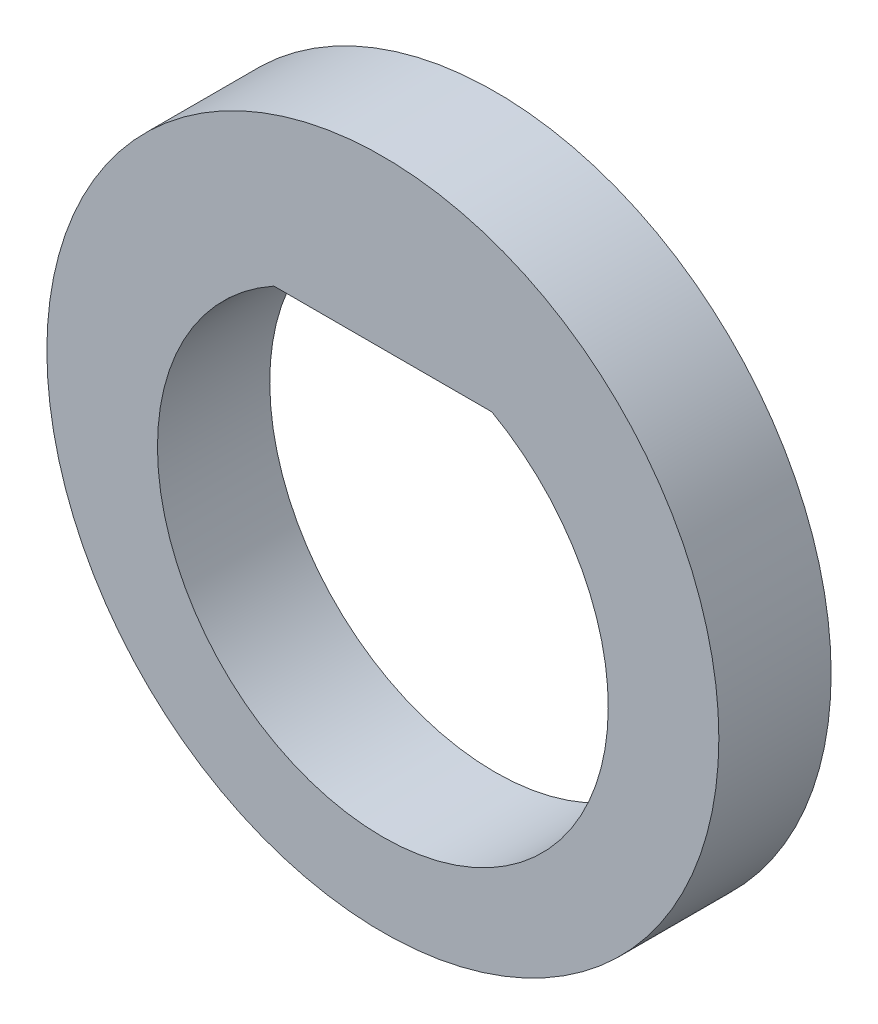
ISO-10303-21;
HEADER;
FILE_DESCRIPTION(('STEP AP214'),'2;1');
FILE_NAME('part.step','',(''),(''),'','','');
FILE_SCHEMA(('AUTOMOTIVE_DESIGN { 1 0 10303 214 1 1 1 1 }'));
ENDSEC;
DATA;
#1=APPLICATION_CONTEXT('core data for automotive mechanical design processes');
#2=APPLICATION_PROTOCOL_DEFINITION('international standard','automotive_design',2000,#1);
#3=PRODUCT_CONTEXT('',#1,'mechanical');
#4=PRODUCT('Part','Part','',(#3));
#5=PRODUCT_RELATED_PRODUCT_CATEGORY('part','',(#4));
#6=PRODUCT_DEFINITION_FORMATION('','',#4);
#7=PRODUCT_DEFINITION_CONTEXT('part definition',#1,'design');
#8=PRODUCT_DEFINITION('design','',#6,#7);
#9=PRODUCT_DEFINITION_SHAPE('','',#8);
#10=(LENGTH_UNIT() NAMED_UNIT(*) SI_UNIT(.MILLI.,.METRE.));
#11=(NAMED_UNIT(*) PLANE_ANGLE_UNIT() SI_UNIT($,.RADIAN.));
#12=(NAMED_UNIT(*) SI_UNIT($,.STERADIAN.) SOLID_ANGLE_UNIT());
#13=UNCERTAINTY_MEASURE_WITH_UNIT(LENGTH_MEASURE(1.E-05),#10,'distance_accuracy_value','');
#14=(GEOMETRIC_REPRESENTATION_CONTEXT(3) GLOBAL_UNCERTAINTY_ASSIGNED_CONTEXT((#13)) GLOBAL_UNIT_ASSIGNED_CONTEXT((#10,
#11,#12)) REPRESENTATION_CONTEXT('',''));
#15=CARTESIAN_POINT('',(0.,0.,0.));
#16=DIRECTION('',(0.,0.,1.));
#17=DIRECTION('',(1.,0.,0.));
#18=AXIS2_PLACEMENT_3D('',#15,#16,#17);
#19=CARTESIAN_POINT('',(0.,-0.5,2.));
#20=DIRECTION('',(0.,0.,-1.));
#21=DIRECTION('',(-1.,0.,0.));
#22=AXIS2_PLACEMENT_3D('',#19,#20,#21);
#23=CYLINDRICAL_SURFACE('',#22,4.015);
#24=CARTESIAN_POINT('',(0.,-0.5,0.));
#25=DIRECTION('',(0.,0.,1.));
#26=DIRECTION('',(1.,0.,0.));
#27=AXIS2_PLACEMENT_3D('',#24,#25,#26);
#28=CIRCLE('',#27,4.015);
#29=CARTESIAN_POINT('',(-1.94036079119323,3.015,0.));
#30=VERTEX_POINT('',#29);
#31=CARTESIAN_POINT('',(1.94036079119323,3.015,0.));
#32=VERTEX_POINT('',#31);
#33=EDGE_CURVE('E65',#30,#32,#28,.T.);
#34=ORIENTED_EDGE('',*,*,#33,.F.);
#35=DIRECTION('',(0.,0.,-1.));
#36=VECTOR('',#35,1.);
#37=CARTESIAN_POINT('',(-1.94036079119323,3.015,2.));
#38=LINE('',#37,#36);
#39=CARTESIAN_POINT('',(-1.94036079119323,3.015,2.));
#40=VERTEX_POINT('',#39);
#41=EDGE_CURVE('E11',#40,#30,#38,.T.);
#42=ORIENTED_EDGE('',*,*,#41,.F.);
#43=CARTESIAN_POINT('',(0.,-0.5,2.));
#44=DIRECTION('',(0.,0.,1.));
#45=DIRECTION('',(1.,0.,0.));
#46=AXIS2_PLACEMENT_3D('',#43,#44,#45);
#47=CIRCLE('',#46,4.015);
#48=CARTESIAN_POINT('',(1.94036079119323,3.015,2.));
#49=VERTEX_POINT('',#48);
#50=EDGE_CURVE('E66',#40,#49,#47,.T.);
#51=ORIENTED_EDGE('',*,*,#50,.T.);
#52=DIRECTION('',(0.,0.,-1.));
#53=VECTOR('',#52,1.);
#54=CARTESIAN_POINT('',(1.94036079119323,3.015,2.));
#55=LINE('',#54,#53);
#56=EDGE_CURVE('E45',#49,#32,#55,.T.);
#57=ORIENTED_EDGE('',*,*,#56,.T.);
#58=EDGE_LOOP('',(#34,#42,#51,#57));
#59=FACE_BOUND('',#58,.T.);
#60=ADVANCED_FACE('F37',(#59),#23,.F.);
#61=CARTESIAN_POINT('',(0.,3.015,2.));
#62=DIRECTION('',(0.,1.,0.));
#63=DIRECTION('',(0.,0.,1.));
#64=AXIS2_PLACEMENT_3D('',#61,#62,#63);
#65=PLANE('',#64);
#66=DIRECTION('',(1.,0.,0.));
#67=VECTOR('',#66,1.);
#68=CARTESIAN_POINT('',(0.,3.015,0.));
#69=LINE('',#68,#67);
#70=EDGE_CURVE('E68',#30,#32,#69,.T.);
#71=ORIENTED_EDGE('',*,*,#70,.T.);
#72=ORIENTED_EDGE('',*,*,#56,.F.);
#73=DIRECTION('',(1.,0.,0.));
#74=VECTOR('',#73,1.);
#75=CARTESIAN_POINT('',(0.,3.015,2.));
#76=LINE('',#75,#74);
#77=EDGE_CURVE('E52',#40,#49,#76,.T.);
#78=ORIENTED_EDGE('',*,*,#77,.F.);
#79=ORIENTED_EDGE('',*,*,#41,.T.);
#80=EDGE_LOOP('',(#71,#72,#78,#79));
#81=FACE_BOUND('',#80,.T.);
#82=ADVANCED_FACE('F69',(#81),#65,.F.);
#83=CARTESIAN_POINT('',(0.,0.,2.));
#84=DIRECTION('',(0.,0.,-1.));
#85=DIRECTION('',(-1.,0.,0.));
#86=AXIS2_PLACEMENT_3D('',#83,#84,#85);
#87=CYLINDRICAL_SURFACE('',#86,5.985);
#88=CARTESIAN_POINT('',(0.,0.,2.));
#89=DIRECTION('',(0.,0.,1.));
#90=DIRECTION('',(1.,0.,0.));
#91=AXIS2_PLACEMENT_3D('',#88,#89,#90);
#92=CIRCLE('',#91,5.985);
#93=CARTESIAN_POINT('',(5.985,0.,2.));
#94=VERTEX_POINT('',#93);
#95=EDGE_CURVE('E67',#94,#94,#92,.T.);
#96=ORIENTED_EDGE('',*,*,#95,.F.);
#97=EDGE_LOOP('',(#96));
#98=FACE_BOUND('',#97,.T.);
#99=CARTESIAN_POINT('',(0.,0.,0.));
#100=DIRECTION('',(0.,0.,1.));
#101=DIRECTION('',(1.,0.,0.));
#102=AXIS2_PLACEMENT_3D('',#99,#100,#101);
#103=CIRCLE('',#102,5.985);
#104=CARTESIAN_POINT('',(5.985,0.,0.));
#105=VERTEX_POINT('',#104);
#106=EDGE_CURVE('E71',#105,#105,#103,.T.);
#107=ORIENTED_EDGE('',*,*,#106,.T.);
#108=EDGE_LOOP('',(#107));
#109=FACE_BOUND('',#108,.T.);
#110=ADVANCED_FACE('F88',(#98,#109),#87,.T.);
#111=CARTESIAN_POINT('',(0.,0.,2.));
#112=DIRECTION('',(0.,0.,1.));
#113=DIRECTION('',(1.,0.,0.));
#114=AXIS2_PLACEMENT_3D('',#111,#112,#113);
#115=PLANE('',#114);
#116=ORIENTED_EDGE('',*,*,#50,.F.);
#117=ORIENTED_EDGE('',*,*,#77,.T.);
#118=EDGE_LOOP('',(#116,#117));
#119=FACE_BOUND('',#118,.T.);
#120=ORIENTED_EDGE('',*,*,#95,.T.);
#121=EDGE_LOOP('',(#120));
#122=FACE_BOUND('',#121,.T.);
#123=ADVANCED_FACE('F86',(#119,#122),#115,.T.);
#124=CARTESIAN_POINT('',(0.,0.,0.));
#125=DIRECTION('',(0.,0.,1.));
#126=DIRECTION('',(1.,0.,0.));
#127=AXIS2_PLACEMENT_3D('',#124,#125,#126);
#128=PLANE('',#127);
#129=ORIENTED_EDGE('',*,*,#33,.T.);
#130=ORIENTED_EDGE('',*,*,#70,.F.);
#131=EDGE_LOOP('',(#129,#130));
#132=FACE_BOUND('',#131,.T.);
#133=ORIENTED_EDGE('',*,*,#106,.F.);
#134=EDGE_LOOP('',(#133));
#135=FACE_BOUND('',#134,.T.);
#136=ADVANCED_FACE('F73',(#132,#135),#128,.F.);
#137=CLOSED_SHELL('',(#60,#82,#110,#123,#136));
#138=MANIFOLD_SOLID_BREP('B2',#137);
#139=ADVANCED_BREP_SHAPE_REPRESENTATION('',(#18,#138),#14);
#140=SHAPE_DEFINITION_REPRESENTATION(#9,#139);
ENDSEC;
END-ISO-10303-21;
